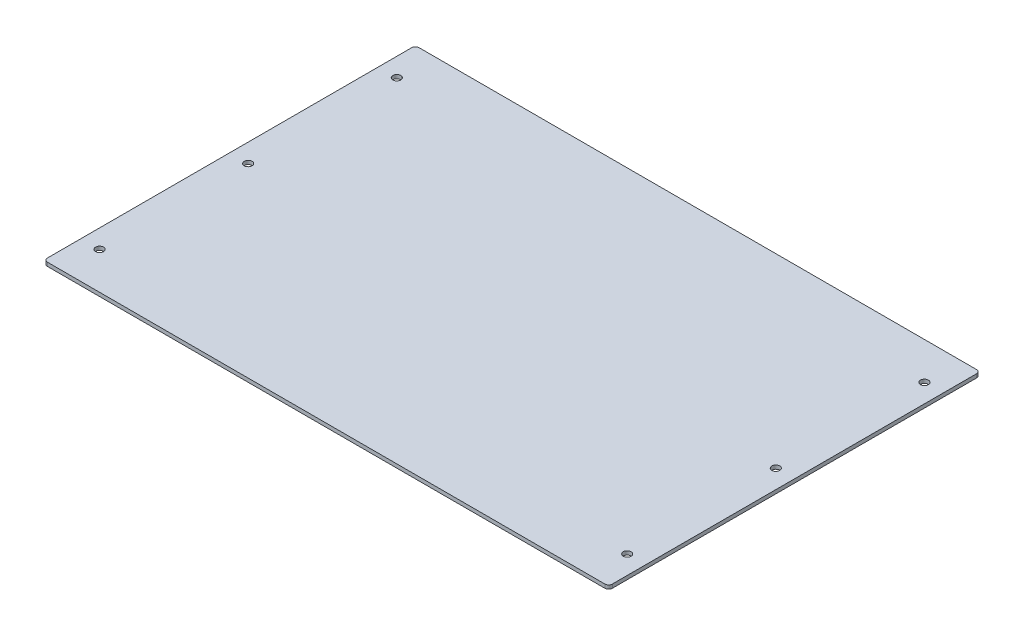
ISO-10303-21;
HEADER;
FILE_DESCRIPTION(('STEP AP214'),'2;1');
FILE_NAME('part.step','',(''),(''),'','','');
FILE_SCHEMA(('AUTOMOTIVE_DESIGN { 1 0 10303 214 1 1 1 1 }'));
ENDSEC;
DATA;
#1=APPLICATION_CONTEXT('core data for automotive mechanical design processes');
#2=APPLICATION_PROTOCOL_DEFINITION('international standard','automotive_design',2000,#1);
#3=PRODUCT_CONTEXT('',#1,'mechanical');
#4=PRODUCT('Part','Part','',(#3));
#5=PRODUCT_RELATED_PRODUCT_CATEGORY('part','',(#4));
#6=PRODUCT_DEFINITION_FORMATION('','',#4);
#7=PRODUCT_DEFINITION_CONTEXT('part definition',#1,'design');
#8=PRODUCT_DEFINITION('design','',#6,#7);
#9=PRODUCT_DEFINITION_SHAPE('','',#8);
#10=(LENGTH_UNIT() NAMED_UNIT(*) SI_UNIT(.MILLI.,.METRE.));
#11=(NAMED_UNIT(*) PLANE_ANGLE_UNIT() SI_UNIT($,.RADIAN.));
#12=(NAMED_UNIT(*) SI_UNIT($,.STERADIAN.) SOLID_ANGLE_UNIT());
#13=UNCERTAINTY_MEASURE_WITH_UNIT(LENGTH_MEASURE(1.E-05),#10,'distance_accuracy_value','');
#14=(GEOMETRIC_REPRESENTATION_CONTEXT(3) GLOBAL_UNCERTAINTY_ASSIGNED_CONTEXT((#13)) GLOBAL_UNIT_ASSIGNED_CONTEXT((#10,
#11,#12)) REPRESENTATION_CONTEXT('',''));
#15=CARTESIAN_POINT('',(0.,0.,0.));
#16=DIRECTION('',(0.,0.,1.));
#17=DIRECTION('',(1.,0.,0.));
#18=AXIS2_PLACEMENT_3D('',#15,#16,#17);
#19=CARTESIAN_POINT('',(-238.125,3.175,155.575));
#20=DIRECTION('',(0.,-1.,0.));
#21=DIRECTION('',(0.,0.,-1.));
#22=AXIS2_PLACEMENT_3D('',#19,#20,#21);
#23=CYLINDRICAL_SURFACE('',#22,3.17500000000001);
#24=CARTESIAN_POINT('',(-238.125,0.,155.575));
#25=DIRECTION('',(0.,1.,0.));
#26=DIRECTION('',(0.,0.,-1.));
#27=AXIS2_PLACEMENT_3D('',#24,#25,#26);
#28=CIRCLE('',#27,3.17500000000001);
#29=CARTESIAN_POINT('',(-241.3,0.,155.575));
#30=VERTEX_POINT('',#29);
#31=CARTESIAN_POINT('',(-238.125,0.,158.75));
#32=VERTEX_POINT('',#31);
#33=EDGE_CURVE('E138',#30,#32,#28,.T.);
#34=ORIENTED_EDGE('',*,*,#33,.T.);
#35=DIRECTION('',(0.,-1.,0.));
#36=VECTOR('',#35,1.);
#37=CARTESIAN_POINT('',(-238.125,3.175,158.75));
#38=LINE('',#37,#36);
#39=CARTESIAN_POINT('',(-238.125,3.175,158.75));
#40=VERTEX_POINT('',#39);
#41=EDGE_CURVE('E11',#40,#32,#38,.T.);
#42=ORIENTED_EDGE('',*,*,#41,.F.);
#43=CARTESIAN_POINT('',(-238.125,3.175,155.575));
#44=DIRECTION('',(0.,1.,0.));
#45=DIRECTION('',(0.,0.,-1.));
#46=AXIS2_PLACEMENT_3D('',#43,#44,#45);
#47=CIRCLE('',#46,3.17500000000001);
#48=CARTESIAN_POINT('',(-241.3,3.175,155.575));
#49=VERTEX_POINT('',#48);
#50=EDGE_CURVE('E161',#49,#40,#47,.T.);
#51=ORIENTED_EDGE('',*,*,#50,.F.);
#52=DIRECTION('',(0.,-1.,0.));
#53=VECTOR('',#52,1.);
#54=CARTESIAN_POINT('',(-241.3,3.175,155.575));
#55=LINE('',#54,#53);
#56=EDGE_CURVE('E134',#49,#30,#55,.T.);
#57=ORIENTED_EDGE('',*,*,#56,.T.);
#58=EDGE_LOOP('',(#34,#42,#51,#57));
#59=FACE_BOUND('',#58,.T.);
#60=ADVANCED_FACE('F36',(#59),#23,.T.);
#61=CARTESIAN_POINT('',(-238.125,3.175,158.75));
#62=DIRECTION('',(0.,0.,-1.));
#63=DIRECTION('',(-1.,0.,0.));
#64=AXIS2_PLACEMENT_3D('',#61,#62,#63);
#65=PLANE('',#64);
#66=DIRECTION('',(1.,0.,0.));
#67=VECTOR('',#66,1.);
#68=CARTESIAN_POINT('',(-238.125,0.,158.75));
#69=LINE('',#68,#67);
#70=CARTESIAN_POINT('',(238.125,0.,158.75));
#71=VERTEX_POINT('',#70);
#72=EDGE_CURVE('E142',#32,#71,#69,.T.);
#73=ORIENTED_EDGE('',*,*,#72,.T.);
#74=DIRECTION('',(0.,-1.,0.));
#75=VECTOR('',#74,1.);
#76=CARTESIAN_POINT('',(238.125,3.175,158.75));
#77=LINE('',#76,#75);
#78=CARTESIAN_POINT('',(238.125,3.175,158.75));
#79=VERTEX_POINT('',#78);
#80=EDGE_CURVE('E45',#79,#71,#77,.T.);
#81=ORIENTED_EDGE('',*,*,#80,.F.);
#82=DIRECTION('',(1.,0.,0.));
#83=VECTOR('',#82,1.);
#84=CARTESIAN_POINT('',(-238.125,3.175,158.75));
#85=LINE('',#84,#83);
#86=EDGE_CURVE('E96',#40,#79,#85,.T.);
#87=ORIENTED_EDGE('',*,*,#86,.F.);
#88=ORIENTED_EDGE('',*,*,#41,.T.);
#89=EDGE_LOOP('',(#73,#81,#87,#88));
#90=FACE_BOUND('',#89,.T.);
#91=ADVANCED_FACE('F288',(#90),#65,.F.);
#92=CARTESIAN_POINT('',(238.125,3.175,155.575));
#93=DIRECTION('',(0.,-1.,0.));
#94=DIRECTION('',(0.,0.,-1.));
#95=AXIS2_PLACEMENT_3D('',#92,#93,#94);
#96=CYLINDRICAL_SURFACE('',#95,3.17500000000001);
#97=CARTESIAN_POINT('',(238.125,0.,155.575));
#98=DIRECTION('',(0.,1.,0.));
#99=DIRECTION('',(0.,0.,1.));
#100=AXIS2_PLACEMENT_3D('',#97,#98,#99);
#101=CIRCLE('',#100,3.17500000000001);
#102=CARTESIAN_POINT('',(241.3,0.,155.575));
#103=VERTEX_POINT('',#102);
#104=EDGE_CURVE('E146',#71,#103,#101,.T.);
#105=ORIENTED_EDGE('',*,*,#104,.T.);
#106=DIRECTION('',(0.,-1.,0.));
#107=VECTOR('',#106,1.);
#108=CARTESIAN_POINT('',(241.3,3.175,155.575));
#109=LINE('',#108,#107);
#110=CARTESIAN_POINT('',(241.3,3.175,155.575));
#111=VERTEX_POINT('',#110);
#112=EDGE_CURVE('E172',#111,#103,#109,.T.);
#113=ORIENTED_EDGE('',*,*,#112,.F.);
#114=CARTESIAN_POINT('',(238.125,3.175,155.575));
#115=DIRECTION('',(0.,1.,0.));
#116=DIRECTION('',(0.,0.,1.));
#117=AXIS2_PLACEMENT_3D('',#114,#115,#116);
#118=CIRCLE('',#117,3.17500000000001);
#119=EDGE_CURVE('E183',#79,#111,#118,.T.);
#120=ORIENTED_EDGE('',*,*,#119,.F.);
#121=ORIENTED_EDGE('',*,*,#80,.T.);
#122=EDGE_LOOP('',(#105,#113,#120,#121));
#123=FACE_BOUND('',#122,.T.);
#124=ADVANCED_FACE('F181',(#123),#96,.T.);
#125=CARTESIAN_POINT('',(241.3,3.175,155.575));
#126=DIRECTION('',(-1.,0.,0.));
#127=DIRECTION('',(0.,0.,1.));
#128=AXIS2_PLACEMENT_3D('',#125,#126,#127);
#129=PLANE('',#128);
#130=DIRECTION('',(0.,0.,-1.));
#131=VECTOR('',#130,1.);
#132=CARTESIAN_POINT('',(241.3,0.,155.575));
#133=LINE('',#132,#131);
#134=CARTESIAN_POINT('',(241.3,0.,-155.575));
#135=VERTEX_POINT('',#134);
#136=EDGE_CURVE('E149',#103,#135,#133,.T.);
#137=ORIENTED_EDGE('',*,*,#136,.T.);
#138=DIRECTION('',(0.,-1.,0.));
#139=VECTOR('',#138,1.);
#140=CARTESIAN_POINT('',(241.3,3.175,-155.575));
#141=LINE('',#140,#139);
#142=CARTESIAN_POINT('',(241.3,3.175,-155.575));
#143=VERTEX_POINT('',#142);
#144=EDGE_CURVE('E168',#143,#135,#141,.T.);
#145=ORIENTED_EDGE('',*,*,#144,.F.);
#146=DIRECTION('',(0.,0.,-1.));
#147=VECTOR('',#146,1.);
#148=CARTESIAN_POINT('',(241.3,3.175,155.575));
#149=LINE('',#148,#147);
#150=EDGE_CURVE('E196',#111,#143,#149,.T.);
#151=ORIENTED_EDGE('',*,*,#150,.F.);
#152=ORIENTED_EDGE('',*,*,#112,.T.);
#153=EDGE_LOOP('',(#137,#145,#151,#152));
#154=FACE_BOUND('',#153,.T.);
#155=ADVANCED_FACE('F191',(#154),#129,.F.);
#156=CARTESIAN_POINT('',(238.125,3.175,-155.575));
#157=DIRECTION('',(0.,-1.,0.));
#158=DIRECTION('',(0.,0.,-1.));
#159=AXIS2_PLACEMENT_3D('',#156,#157,#158);
#160=CYLINDRICAL_SURFACE('',#159,3.17500000000001);
#161=CARTESIAN_POINT('',(238.125,0.,-155.575));
#162=DIRECTION('',(0.,1.,0.));
#163=DIRECTION('',(0.,0.,-1.));
#164=AXIS2_PLACEMENT_3D('',#161,#162,#163);
#165=CIRCLE('',#164,3.17500000000001);
#166=CARTESIAN_POINT('',(238.125,0.,-158.75));
#167=VERTEX_POINT('',#166);
#168=EDGE_CURVE('E152',#135,#167,#165,.T.);
#169=ORIENTED_EDGE('',*,*,#168,.T.);
#170=DIRECTION('',(0.,-1.,0.));
#171=VECTOR('',#170,1.);
#172=CARTESIAN_POINT('',(238.125,3.175,-158.75));
#173=LINE('',#172,#171);
#174=CARTESIAN_POINT('',(238.125,3.175,-158.75));
#175=VERTEX_POINT('',#174);
#176=EDGE_CURVE('E126',#175,#167,#173,.T.);
#177=ORIENTED_EDGE('',*,*,#176,.F.);
#178=CARTESIAN_POINT('',(238.125,3.175,-155.575));
#179=DIRECTION('',(0.,1.,0.));
#180=DIRECTION('',(0.,0.,-1.));
#181=AXIS2_PLACEMENT_3D('',#178,#179,#180);
#182=CIRCLE('',#181,3.17500000000001);
#183=EDGE_CURVE('E115',#143,#175,#182,.T.);
#184=ORIENTED_EDGE('',*,*,#183,.F.);
#185=ORIENTED_EDGE('',*,*,#144,.T.);
#186=EDGE_LOOP('',(#169,#177,#184,#185));
#187=FACE_BOUND('',#186,.T.);
#188=ADVANCED_FACE('F194',(#187),#160,.T.);
#189=CARTESIAN_POINT('',(-238.125,3.175,-158.75));
#190=DIRECTION('',(0.,0.,1.));
#191=DIRECTION('',(1.,0.,0.));
#192=AXIS2_PLACEMENT_3D('',#189,#190,#191);
#193=PLANE('',#192);
#194=DIRECTION('',(-1.,0.,0.));
#195=VECTOR('',#194,1.);
#196=CARTESIAN_POINT('',(-238.125,0.,-158.75));
#197=LINE('',#196,#195);
#198=CARTESIAN_POINT('',(-238.125,0.,-158.75));
#199=VERTEX_POINT('',#198);
#200=EDGE_CURVE('E124',#167,#199,#197,.T.);
#201=ORIENTED_EDGE('',*,*,#200,.T.);
#202=DIRECTION('',(0.,-1.,0.));
#203=VECTOR('',#202,1.);
#204=CARTESIAN_POINT('',(-238.125,3.175,-158.75));
#205=LINE('',#204,#203);
#206=CARTESIAN_POINT('',(-238.125,3.175,-158.75));
#207=VERTEX_POINT('',#206);
#208=EDGE_CURVE('E121',#207,#199,#205,.T.);
#209=ORIENTED_EDGE('',*,*,#208,.F.);
#210=DIRECTION('',(-1.,0.,0.));
#211=VECTOR('',#210,1.);
#212=CARTESIAN_POINT('',(-238.125,3.175,-158.75));
#213=LINE('',#212,#211);
#214=EDGE_CURVE('E109',#175,#207,#213,.T.);
#215=ORIENTED_EDGE('',*,*,#214,.F.);
#216=ORIENTED_EDGE('',*,*,#176,.T.);
#217=EDGE_LOOP('',(#201,#209,#215,#216));
#218=FACE_BOUND('',#217,.T.);
#219=ADVANCED_FACE('F122',(#218),#193,.F.);
#220=CARTESIAN_POINT('',(-238.125,3.175,-155.575));
#221=DIRECTION('',(0.,-1.,0.));
#222=DIRECTION('',(0.,0.,-1.));
#223=AXIS2_PLACEMENT_3D('',#220,#221,#222);
#224=CYLINDRICAL_SURFACE('',#223,3.17500000000001);
#225=CARTESIAN_POINT('',(-238.125,0.,-155.575));
#226=DIRECTION('',(0.,1.,0.));
#227=DIRECTION('',(0.,0.,-1.));
#228=AXIS2_PLACEMENT_3D('',#225,#226,#227);
#229=CIRCLE('',#228,3.17500000000001);
#230=CARTESIAN_POINT('',(-241.3,0.,-155.575));
#231=VERTEX_POINT('',#230);
#232=EDGE_CURVE('E82',#199,#231,#229,.T.);
#233=ORIENTED_EDGE('',*,*,#232,.T.);
#234=DIRECTION('',(0.,-1.,0.));
#235=VECTOR('',#234,1.);
#236=CARTESIAN_POINT('',(-241.3,3.175,-155.575));
#237=LINE('',#236,#235);
#238=CARTESIAN_POINT('',(-241.3,3.175,-155.575));
#239=VERTEX_POINT('',#238);
#240=EDGE_CURVE('E127',#239,#231,#237,.T.);
#241=ORIENTED_EDGE('',*,*,#240,.F.);
#242=CARTESIAN_POINT('',(-238.125,3.175,-155.575));
#243=DIRECTION('',(0.,1.,0.));
#244=DIRECTION('',(0.,0.,-1.));
#245=AXIS2_PLACEMENT_3D('',#242,#243,#244);
#246=CIRCLE('',#245,3.17500000000001);
#247=EDGE_CURVE('E113',#207,#239,#246,.T.);
#248=ORIENTED_EDGE('',*,*,#247,.F.);
#249=ORIENTED_EDGE('',*,*,#208,.T.);
#250=EDGE_LOOP('',(#233,#241,#248,#249));
#251=FACE_BOUND('',#250,.T.);
#252=ADVANCED_FACE('F129',(#251),#224,.T.);
#253=CARTESIAN_POINT('',(-241.3,3.175,155.575));
#254=DIRECTION('',(1.,0.,0.));
#255=DIRECTION('',(0.,0.,-1.));
#256=AXIS2_PLACEMENT_3D('',#253,#254,#255);
#257=PLANE('',#256);
#258=DIRECTION('',(0.,0.,1.));
#259=VECTOR('',#258,1.);
#260=CARTESIAN_POINT('',(-241.3,0.,155.575));
#261=LINE('',#260,#259);
#262=EDGE_CURVE('E88',#231,#30,#261,.T.);
#263=ORIENTED_EDGE('',*,*,#262,.T.);
#264=ORIENTED_EDGE('',*,*,#56,.F.);
#265=DIRECTION('',(0.,0.,1.));
#266=VECTOR('',#265,1.);
#267=CARTESIAN_POINT('',(-241.3,3.175,155.575));
#268=LINE('',#267,#266);
#269=EDGE_CURVE('E53',#239,#49,#268,.T.);
#270=ORIENTED_EDGE('',*,*,#269,.F.);
#271=ORIENTED_EDGE('',*,*,#240,.T.);
#272=EDGE_LOOP('',(#263,#264,#270,#271));
#273=FACE_BOUND('',#272,.T.);
#274=ADVANCED_FACE('F260',(#273),#257,.F.);
#275=CARTESIAN_POINT('',(-238.125,3.175,155.575));
#276=DIRECTION('',(0.,-1.,0.));
#277=DIRECTION('',(0.,0.,-1.));
#278=AXIS2_PLACEMENT_3D('',#275,#276,#277);
#279=PLANE('',#278);
#280=CARTESIAN_POINT('',(-225.425,3.175,-127.));
#281=DIRECTION('',(0.,1.,0.));
#282=DIRECTION('',(0.,0.,1.));
#283=AXIS2_PLACEMENT_3D('',#280,#281,#282);
#284=CIRCLE('',#283,3.37350099999995);
#285=CARTESIAN_POINT('',(-225.425,3.175,-123.626499));
#286=VERTEX_POINT('',#285);
#287=EDGE_CURVE('E250',#286,#286,#284,.T.);
#288=ORIENTED_EDGE('',*,*,#287,.F.);
#289=EDGE_LOOP('',(#288));
#290=FACE_BOUND('',#289,.T.);
#291=CARTESIAN_POINT('',(-225.425,3.175,0.));
#292=DIRECTION('',(0.,1.,0.));
#293=DIRECTION('',(0.,0.,1.));
#294=AXIS2_PLACEMENT_3D('',#291,#292,#293);
#295=CIRCLE('',#294,3.37350099999995);
#296=CARTESIAN_POINT('',(-225.425,3.175,3.37350099999995));
#297=VERTEX_POINT('',#296);
#298=EDGE_CURVE('E242',#297,#297,#295,.T.);
#299=ORIENTED_EDGE('',*,*,#298,.F.);
#300=EDGE_LOOP('',(#299));
#301=FACE_BOUND('',#300,.T.);
#302=CARTESIAN_POINT('',(-225.425,3.175,127.));
#303=DIRECTION('',(0.,1.,0.));
#304=DIRECTION('',(0.,0.,1.));
#305=AXIS2_PLACEMENT_3D('',#302,#303,#304);
#306=CIRCLE('',#305,3.37350099999995);
#307=CARTESIAN_POINT('',(-225.425,3.175,130.373501));
#308=VERTEX_POINT('',#307);
#309=EDGE_CURVE('E234',#308,#308,#306,.T.);
#310=ORIENTED_EDGE('',*,*,#309,.F.);
#311=EDGE_LOOP('',(#310));
#312=FACE_BOUND('',#311,.T.);
#313=CARTESIAN_POINT('',(225.425,3.175,-127.));
#314=DIRECTION('',(0.,1.,0.));
#315=DIRECTION('',(0.,0.,1.));
#316=AXIS2_PLACEMENT_3D('',#313,#314,#315);
#317=CIRCLE('',#316,3.37350099999995);
#318=CARTESIAN_POINT('',(225.425,3.175,-123.626499));
#319=VERTEX_POINT('',#318);
#320=EDGE_CURVE('E226',#319,#319,#317,.T.);
#321=ORIENTED_EDGE('',*,*,#320,.F.);
#322=EDGE_LOOP('',(#321));
#323=FACE_BOUND('',#322,.T.);
#324=CARTESIAN_POINT('',(225.425,3.175,0.));
#325=DIRECTION('',(0.,1.,0.));
#326=DIRECTION('',(0.,0.,1.));
#327=AXIS2_PLACEMENT_3D('',#324,#325,#326);
#328=CIRCLE('',#327,3.37350099999995);
#329=CARTESIAN_POINT('',(225.425,3.175,3.37350099999995));
#330=VERTEX_POINT('',#329);
#331=EDGE_CURVE('E218',#330,#330,#328,.T.);
#332=ORIENTED_EDGE('',*,*,#331,.F.);
#333=EDGE_LOOP('',(#332));
#334=FACE_BOUND('',#333,.T.);
#335=CARTESIAN_POINT('',(225.425,3.175,127.));
#336=DIRECTION('',(0.,1.,0.));
#337=DIRECTION('',(0.,0.,1.));
#338=AXIS2_PLACEMENT_3D('',#335,#336,#337);
#339=CIRCLE('',#338,3.37350099999995);
#340=CARTESIAN_POINT('',(225.425,3.175,130.373501));
#341=VERTEX_POINT('',#340);
#342=EDGE_CURVE('E210',#341,#341,#339,.T.);
#343=ORIENTED_EDGE('',*,*,#342,.F.);
#344=EDGE_LOOP('',(#343));
#345=FACE_BOUND('',#344,.T.);
#346=ORIENTED_EDGE('',*,*,#50,.T.);
#347=ORIENTED_EDGE('',*,*,#86,.T.);
#348=ORIENTED_EDGE('',*,*,#119,.T.);
#349=ORIENTED_EDGE('',*,*,#150,.T.);
#350=ORIENTED_EDGE('',*,*,#183,.T.);
#351=ORIENTED_EDGE('',*,*,#214,.T.);
#352=ORIENTED_EDGE('',*,*,#247,.T.);
#353=ORIENTED_EDGE('',*,*,#269,.T.);
#354=EDGE_LOOP('',(#346,#347,#348,#349,#350,#351,#352,#353));
#355=FACE_BOUND('',#354,.T.);
#356=ADVANCED_FACE('F111',(#290,#301,#312,#323,#334,#345,#355),#279,.F.);
#357=CARTESIAN_POINT('',(-238.125,0.,155.575));
#358=DIRECTION('',(0.,-1.,0.));
#359=DIRECTION('',(0.,0.,-1.));
#360=AXIS2_PLACEMENT_3D('',#357,#358,#359);
#361=PLANE('',#360);
#362=CARTESIAN_POINT('',(-225.425,0.,-127.));
#363=DIRECTION('',(0.,1.,0.));
#364=DIRECTION('',(0.,0.,1.));
#365=AXIS2_PLACEMENT_3D('',#362,#363,#364);
#366=CIRCLE('',#365,3.37350099999995);
#367=CARTESIAN_POINT('',(-225.425,0.,-123.626499));
#368=VERTEX_POINT('',#367);
#369=EDGE_CURVE('E246',#368,#368,#366,.T.);
#370=ORIENTED_EDGE('',*,*,#369,.T.);
#371=EDGE_LOOP('',(#370));
#372=FACE_BOUND('',#371,.T.);
#373=CARTESIAN_POINT('',(-225.425,0.,0.));
#374=DIRECTION('',(0.,1.,0.));
#375=DIRECTION('',(0.,0.,1.));
#376=AXIS2_PLACEMENT_3D('',#373,#374,#375);
#377=CIRCLE('',#376,3.37350099999995);
#378=CARTESIAN_POINT('',(-225.425,0.,3.37350099999995));
#379=VERTEX_POINT('',#378);
#380=EDGE_CURVE('E238',#379,#379,#377,.T.);
#381=ORIENTED_EDGE('',*,*,#380,.T.);
#382=EDGE_LOOP('',(#381));
#383=FACE_BOUND('',#382,.T.);
#384=CARTESIAN_POINT('',(-225.425,0.,127.));
#385=DIRECTION('',(0.,1.,0.));
#386=DIRECTION('',(0.,0.,1.));
#387=AXIS2_PLACEMENT_3D('',#384,#385,#386);
#388=CIRCLE('',#387,3.37350099999995);
#389=CARTESIAN_POINT('',(-225.425,0.,130.373501));
#390=VERTEX_POINT('',#389);
#391=EDGE_CURVE('E230',#390,#390,#388,.T.);
#392=ORIENTED_EDGE('',*,*,#391,.T.);
#393=EDGE_LOOP('',(#392));
#394=FACE_BOUND('',#393,.T.);
#395=CARTESIAN_POINT('',(225.425,0.,-127.));
#396=DIRECTION('',(0.,1.,0.));
#397=DIRECTION('',(0.,0.,1.));
#398=AXIS2_PLACEMENT_3D('',#395,#396,#397);
#399=CIRCLE('',#398,3.37350099999995);
#400=CARTESIAN_POINT('',(225.425,0.,-123.626499));
#401=VERTEX_POINT('',#400);
#402=EDGE_CURVE('E222',#401,#401,#399,.T.);
#403=ORIENTED_EDGE('',*,*,#402,.T.);
#404=EDGE_LOOP('',(#403));
#405=FACE_BOUND('',#404,.T.);
#406=CARTESIAN_POINT('',(225.425,0.,0.));
#407=DIRECTION('',(0.,1.,0.));
#408=DIRECTION('',(0.,0.,1.));
#409=AXIS2_PLACEMENT_3D('',#406,#407,#408);
#410=CIRCLE('',#409,3.37350099999995);
#411=CARTESIAN_POINT('',(225.425,0.,3.37350099999995));
#412=VERTEX_POINT('',#411);
#413=EDGE_CURVE('E214',#412,#412,#410,.T.);
#414=ORIENTED_EDGE('',*,*,#413,.T.);
#415=EDGE_LOOP('',(#414));
#416=FACE_BOUND('',#415,.T.);
#417=CARTESIAN_POINT('',(225.425,0.,127.));
#418=DIRECTION('',(0.,1.,0.));
#419=DIRECTION('',(0.,0.,1.));
#420=AXIS2_PLACEMENT_3D('',#417,#418,#419);
#421=CIRCLE('',#420,3.37350099999995);
#422=CARTESIAN_POINT('',(225.425,0.,130.373501));
#423=VERTEX_POINT('',#422);
#424=EDGE_CURVE('E143',#423,#423,#421,.T.);
#425=ORIENTED_EDGE('',*,*,#424,.T.);
#426=EDGE_LOOP('',(#425));
#427=FACE_BOUND('',#426,.T.);
#428=ORIENTED_EDGE('',*,*,#33,.F.);
#429=ORIENTED_EDGE('',*,*,#262,.F.);
#430=ORIENTED_EDGE('',*,*,#232,.F.);
#431=ORIENTED_EDGE('',*,*,#200,.F.);
#432=ORIENTED_EDGE('',*,*,#168,.F.);
#433=ORIENTED_EDGE('',*,*,#136,.F.);
#434=ORIENTED_EDGE('',*,*,#104,.F.);
#435=ORIENTED_EDGE('',*,*,#72,.F.);
#436=EDGE_LOOP('',(#428,#429,#430,#431,#432,#433,#434,#435));
#437=FACE_BOUND('',#436,.T.);
#438=ADVANCED_FACE('F187',(#372,#383,#394,#405,#416,#427,#437),#361,.T.);
#439=CARTESIAN_POINT('',(225.425,3.175,127.));
#440=DIRECTION('',(0.,1.,0.));
#441=DIRECTION('',(0.,0.,1.));
#442=AXIS2_PLACEMENT_3D('',#439,#440,#441);
#443=CYLINDRICAL_SURFACE('',#442,3.37350099999995);
#444=ORIENTED_EDGE('',*,*,#424,.F.);
#445=EDGE_LOOP('',(#444));
#446=FACE_BOUND('',#445,.T.);
#447=ORIENTED_EDGE('',*,*,#342,.T.);
#448=EDGE_LOOP('',(#447));
#449=FACE_BOUND('',#448,.T.);
#450=ADVANCED_FACE('F272',(#446,#449),#443,.F.);
#451=CARTESIAN_POINT('',(225.425,3.175,0.));
#452=DIRECTION('',(0.,1.,0.));
#453=DIRECTION('',(0.,0.,1.));
#454=AXIS2_PLACEMENT_3D('',#451,#452,#453);
#455=CYLINDRICAL_SURFACE('',#454,3.37350099999995);
#456=ORIENTED_EDGE('',*,*,#413,.F.);
#457=EDGE_LOOP('',(#456));
#458=FACE_BOUND('',#457,.T.);
#459=ORIENTED_EDGE('',*,*,#331,.T.);
#460=EDGE_LOOP('',(#459));
#461=FACE_BOUND('',#460,.T.);
#462=ADVANCED_FACE('F274',(#458,#461),#455,.F.);
#463=CARTESIAN_POINT('',(225.425,3.175,-127.));
#464=DIRECTION('',(0.,1.,0.));
#465=DIRECTION('',(0.,0.,1.));
#466=AXIS2_PLACEMENT_3D('',#463,#464,#465);
#467=CYLINDRICAL_SURFACE('',#466,3.37350099999995);
#468=ORIENTED_EDGE('',*,*,#402,.F.);
#469=EDGE_LOOP('',(#468));
#470=FACE_BOUND('',#469,.T.);
#471=ORIENTED_EDGE('',*,*,#320,.T.);
#472=EDGE_LOOP('',(#471));
#473=FACE_BOUND('',#472,.T.);
#474=ADVANCED_FACE('F281',(#470,#473),#467,.F.);
#475=CARTESIAN_POINT('',(-225.425,3.175,127.));
#476=DIRECTION('',(0.,1.,0.));
#477=DIRECTION('',(0.,0.,1.));
#478=AXIS2_PLACEMENT_3D('',#475,#476,#477);
#479=CYLINDRICAL_SURFACE('',#478,3.37350099999995);
#480=ORIENTED_EDGE('',*,*,#391,.F.);
#481=EDGE_LOOP('',(#480));
#482=FACE_BOUND('',#481,.T.);
#483=ORIENTED_EDGE('',*,*,#309,.T.);
#484=EDGE_LOOP('',(#483));
#485=FACE_BOUND('',#484,.T.);
#486=ADVANCED_FACE('F364',(#482,#485),#479,.F.);
#487=CARTESIAN_POINT('',(-225.425,3.175,0.));
#488=DIRECTION('',(0.,1.,0.));
#489=DIRECTION('',(0.,0.,1.));
#490=AXIS2_PLACEMENT_3D('',#487,#488,#489);
#491=CYLINDRICAL_SURFACE('',#490,3.37350099999995);
#492=ORIENTED_EDGE('',*,*,#380,.F.);
#493=EDGE_LOOP('',(#492));
#494=FACE_BOUND('',#493,.T.);
#495=ORIENTED_EDGE('',*,*,#298,.T.);
#496=EDGE_LOOP('',(#495));
#497=FACE_BOUND('',#496,.T.);
#498=ADVANCED_FACE('F374',(#494,#497),#491,.F.);
#499=CARTESIAN_POINT('',(-225.425,3.175,-127.));
#500=DIRECTION('',(0.,1.,0.));
#501=DIRECTION('',(0.,0.,1.));
#502=AXIS2_PLACEMENT_3D('',#499,#500,#501);
#503=CYLINDRICAL_SURFACE('',#502,3.37350099999995);
#504=ORIENTED_EDGE('',*,*,#369,.F.);
#505=EDGE_LOOP('',(#504));
#506=FACE_BOUND('',#505,.T.);
#507=ORIENTED_EDGE('',*,*,#287,.T.);
#508=EDGE_LOOP('',(#507));
#509=FACE_BOUND('',#508,.T.);
#510=ADVANCED_FACE('F256',(#506,#509),#503,.F.);
#511=CLOSED_SHELL('',(#60,#91,#124,#155,#188,#219,#252,#274,#356,#438,#450,#462,#474,#486,#498,#510));
#512=MANIFOLD_SOLID_BREP('B2',#511);
#513=ADVANCED_BREP_SHAPE_REPRESENTATION('',(#18,#512),#14);
#514=SHAPE_DEFINITION_REPRESENTATION(#9,#513);
ENDSEC;
END-ISO-10303-21;
